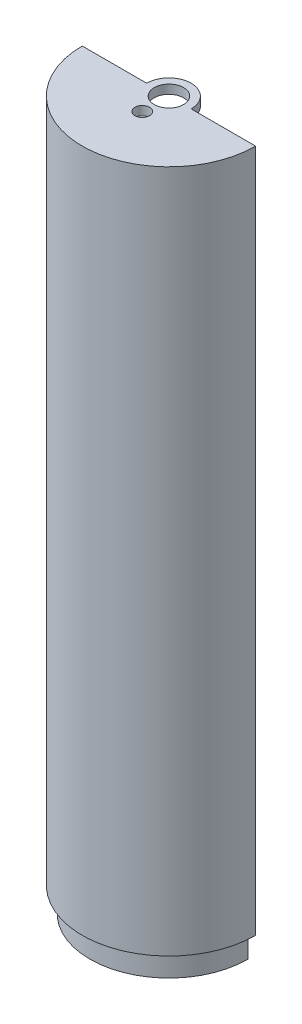
ISO-10303-21;
HEADER;
FILE_DESCRIPTION(('STEP AP214'),'2;1');
FILE_NAME('part.step','',(''),(''),'','','');
FILE_SCHEMA(('AUTOMOTIVE_DESIGN { 1 0 10303 214 1 1 1 1 }'));
ENDSEC;
DATA;
#1=APPLICATION_CONTEXT('core data for automotive mechanical design processes');
#2=APPLICATION_PROTOCOL_DEFINITION('international standard','automotive_design',2000,#1);
#3=PRODUCT_CONTEXT('',#1,'mechanical');
#4=PRODUCT('Part','Part','',(#3));
#5=PRODUCT_RELATED_PRODUCT_CATEGORY('part','',(#4));
#6=PRODUCT_DEFINITION_FORMATION('','',#4);
#7=PRODUCT_DEFINITION_CONTEXT('part definition',#1,'design');
#8=PRODUCT_DEFINITION('design','',#6,#7);
#9=PRODUCT_DEFINITION_SHAPE('','',#8);
#10=(LENGTH_UNIT() NAMED_UNIT(*) SI_UNIT(.MILLI.,.METRE.));
#11=(NAMED_UNIT(*) PLANE_ANGLE_UNIT() SI_UNIT($,.RADIAN.));
#12=(NAMED_UNIT(*) SI_UNIT($,.STERADIAN.) SOLID_ANGLE_UNIT());
#13=UNCERTAINTY_MEASURE_WITH_UNIT(LENGTH_MEASURE(1.E-05),#10,'distance_accuracy_value','');
#14=(GEOMETRIC_REPRESENTATION_CONTEXT(3) GLOBAL_UNCERTAINTY_ASSIGNED_CONTEXT((#13)) GLOBAL_UNIT_ASSIGNED_CONTEXT((#10,
#11,#12)) REPRESENTATION_CONTEXT('',''));
#15=CARTESIAN_POINT('',(0.,0.,0.));
#16=DIRECTION('',(0.,0.,1.));
#17=DIRECTION('',(1.,0.,0.));
#18=AXIS2_PLACEMENT_3D('',#15,#16,#17);
#19=CARTESIAN_POINT('',(0.,384.81,0.));
#20=DIRECTION('',(0.,-1.,0.));
#21=DIRECTION('',(0.,0.,-1.));
#22=AXIS2_PLACEMENT_3D('',#19,#20,#21);
#23=CYLINDRICAL_SURFACE('',#22,12.7);
#24=DIRECTION('',(0.,-1.,0.));
#25=VECTOR('',#24,1.);
#26=CARTESIAN_POINT('',(-12.7,384.81,0.));
#27=LINE('',#26,#25);
#28=CARTESIAN_POINT('',(-12.7,-5.71500000000003,0.));
#29=VERTEX_POINT('',#28);
#30=CARTESIAN_POINT('',(-12.7,-13.97,0.));
#31=VERTEX_POINT('',#30);
#32=EDGE_CURVE('E216',#29,#31,#27,.T.);
#33=ORIENTED_EDGE('',*,*,#32,.F.);
#34=CARTESIAN_POINT('',(0.,-5.71500000000003,0.));
#35=DIRECTION('',(0.,1.,0.));
#36=DIRECTION('',(0.,0.,1.));
#37=AXIS2_PLACEMENT_3D('',#34,#35,#36);
#38=CIRCLE('',#37,12.7);
#39=CARTESIAN_POINT('',(12.7,-5.71500000000003,0.));
#40=VERTEX_POINT('',#39);
#41=EDGE_CURVE('E11',#29,#40,#38,.F.);
#42=ORIENTED_EDGE('',*,*,#41,.T.);
#43=DIRECTION('',(0.,-1.,0.));
#44=VECTOR('',#43,1.);
#45=CARTESIAN_POINT('',(12.7,384.81,0.));
#46=LINE('',#45,#44);
#47=CARTESIAN_POINT('',(12.7,-13.97,0.));
#48=VERTEX_POINT('',#47);
#49=EDGE_CURVE('E219',#40,#48,#46,.T.);
#50=ORIENTED_EDGE('',*,*,#49,.T.);
#51=CARTESIAN_POINT('',(0.,-13.97,0.));
#52=DIRECTION('',(0.,-1.,0.));
#53=DIRECTION('',(0.,0.,-1.));
#54=AXIS2_PLACEMENT_3D('',#51,#52,#53);
#55=CIRCLE('',#54,12.7);
#56=EDGE_CURVE('E199',#31,#48,#55,.T.);
#57=ORIENTED_EDGE('',*,*,#56,.F.);
#58=EDGE_LOOP('',(#33,#42,#50,#57));
#59=FACE_BOUND('',#58,.T.);
#60=ADVANCED_FACE('F37',(#59),#23,.T.);
#61=CARTESIAN_POINT('',(0.,-6.35,0.));
#62=DIRECTION('',(0.,1.,0.));
#63=DIRECTION('',(0.,0.,1.));
#64=AXIS2_PLACEMENT_3D('',#61,#62,#63);
#65=CYLINDRICAL_SURFACE('',#64,49.4538);
#66=DIRECTION('',(0.,-1.,0.));
#67=VECTOR('',#66,1.);
#68=CARTESIAN_POINT('',(-49.4538,384.81,0.));
#69=LINE('',#68,#67);
#70=CARTESIAN_POINT('',(-49.4538,389.89,0.));
#71=VERTEX_POINT('',#70);
#72=CARTESIAN_POINT('',(-49.4538,0.,0.));
#73=VERTEX_POINT('',#72);
#74=EDGE_CURVE('E136',#71,#73,#69,.T.);
#75=ORIENTED_EDGE('',*,*,#74,.T.);
#76=CARTESIAN_POINT('',(0.,0.,0.));
#77=DIRECTION('',(0.,-1.,0.));
#78=DIRECTION('',(0.,0.,-1.));
#79=AXIS2_PLACEMENT_3D('',#76,#77,#78);
#80=CIRCLE('',#79,49.4538);
#81=CARTESIAN_POINT('',(49.4538,0.,0.));
#82=VERTEX_POINT('',#81);
#83=EDGE_CURVE('E61',#82,#73,#80,.T.);
#84=ORIENTED_EDGE('',*,*,#83,.F.);
#85=DIRECTION('',(0.,-1.,0.));
#86=VECTOR('',#85,1.);
#87=CARTESIAN_POINT('',(49.4538,384.81,0.));
#88=LINE('',#87,#86);
#89=CARTESIAN_POINT('',(49.4538,389.89,0.));
#90=VERTEX_POINT('',#89);
#91=EDGE_CURVE('E221',#90,#82,#88,.T.);
#92=ORIENTED_EDGE('',*,*,#91,.F.);
#93=CARTESIAN_POINT('',(0.,389.89,0.));
#94=DIRECTION('',(0.,1.,0.));
#95=DIRECTION('',(0.,0.,1.));
#96=AXIS2_PLACEMENT_3D('',#93,#94,#95);
#97=CIRCLE('',#96,49.4538);
#98=EDGE_CURVE('E140',#71,#90,#97,.T.);
#99=ORIENTED_EDGE('',*,*,#98,.F.);
#100=EDGE_LOOP('',(#75,#84,#92,#99));
#101=FACE_BOUND('',#100,.T.);
#102=ADVANCED_FACE('F39',(#101),#65,.T.);
#103=CARTESIAN_POINT('',(-12.7,384.81,0.));
#104=DIRECTION('',(0.,0.,1.));
#105=DIRECTION('',(1.,0.,0.));
#106=AXIS2_PLACEMENT_3D('',#103,#104,#105);
#107=PLANE('',#106);
#108=DIRECTION('',(0.,1.,0.));
#109=VECTOR('',#108,1.);
#110=CARTESIAN_POINT('',(-46.2788,-6.35,0.));
#111=LINE('',#110,#109);
#112=CARTESIAN_POINT('',(-46.2788,5.715,0.));
#113=VERTEX_POINT('',#112);
#114=CARTESIAN_POINT('',(-46.2788,384.81,0.));
#115=VERTEX_POINT('',#114);
#116=EDGE_CURVE('E227',#113,#115,#111,.T.);
#117=ORIENTED_EDGE('',*,*,#116,.F.);
#118=DIRECTION('',(-1.,0.,0.));
#119=VECTOR('',#118,1.);
#120=CARTESIAN_POINT('',(-46.2788,5.715,0.));
#121=LINE('',#120,#119);
#122=CARTESIAN_POINT('',(-35.56,5.715,0.));
#123=VERTEX_POINT('',#122);
#124=EDGE_CURVE('E170',#123,#113,#121,.T.);
#125=ORIENTED_EDGE('',*,*,#124,.F.);
#126=DIRECTION('',(0.,1.,0.));
#127=VECTOR('',#126,1.);
#128=CARTESIAN_POINT('',(-35.56,-5.715,0.));
#129=LINE('',#128,#127);
#130=CARTESIAN_POINT('',(-35.56,-5.715,0.));
#131=VERTEX_POINT('',#130);
#132=EDGE_CURVE('E189',#123,#131,#129,.F.);
#133=ORIENTED_EDGE('',*,*,#132,.T.);
#134=DIRECTION('',(-1.,0.,0.));
#135=VECTOR('',#134,1.);
#136=CARTESIAN_POINT('',(-12.7,-5.71500000000003,0.));
#137=LINE('',#136,#135);
#138=EDGE_CURVE('E194',#29,#131,#137,.T.);
#139=ORIENTED_EDGE('',*,*,#138,.F.);
#140=ORIENTED_EDGE('',*,*,#32,.T.);
#141=DIRECTION('',(-1.,0.,0.));
#142=VECTOR('',#141,1.);
#143=CARTESIAN_POINT('',(-12.7,-13.97,0.));
#144=LINE('',#143,#142);
#145=CARTESIAN_POINT('',(-45.085,-13.97,0.));
#146=VERTEX_POINT('',#145);
#147=EDGE_CURVE('E202',#31,#146,#144,.T.);
#148=ORIENTED_EDGE('',*,*,#147,.T.);
#149=DIRECTION('',(0.,-1.,0.));
#150=VECTOR('',#149,1.);
#151=CARTESIAN_POINT('',(-45.085,0.,0.));
#152=LINE('',#151,#150);
#153=CARTESIAN_POINT('',(-45.085,0.,0.));
#154=VERTEX_POINT('',#153);
#155=EDGE_CURVE('E212',#154,#146,#152,.T.);
#156=ORIENTED_EDGE('',*,*,#155,.F.);
#157=DIRECTION('',(1.,0.,0.));
#158=VECTOR('',#157,1.);
#159=CARTESIAN_POINT('',(-12.7,0.,0.));
#160=LINE('',#159,#158);
#161=EDGE_CURVE('E214',#73,#154,#160,.T.);
#162=ORIENTED_EDGE('',*,*,#161,.F.);
#163=ORIENTED_EDGE('',*,*,#74,.F.);
#164=DIRECTION('',(-1.,0.,0.));
#165=VECTOR('',#164,1.);
#166=CARTESIAN_POINT('',(-12.7,389.89,0.));
#167=LINE('',#166,#165);
#168=CARTESIAN_POINT('',(-12.7,389.89,0.));
#169=VERTEX_POINT('',#168);
#170=EDGE_CURVE('E127',#169,#71,#167,.T.);
#171=ORIENTED_EDGE('',*,*,#170,.F.);
#172=DIRECTION('',(0.,-1.,0.));
#173=VECTOR('',#172,1.);
#174=CARTESIAN_POINT('',(-12.7,389.89,0.));
#175=LINE('',#174,#173);
#176=CARTESIAN_POINT('',(-12.7,384.81,0.));
#177=VERTEX_POINT('',#176);
#178=EDGE_CURVE('E133',#169,#177,#175,.T.);
#179=ORIENTED_EDGE('',*,*,#178,.T.);
#180=DIRECTION('',(-1.,0.,0.));
#181=VECTOR('',#180,1.);
#182=CARTESIAN_POINT('',(-46.2788,384.81,0.));
#183=LINE('',#182,#181);
#184=EDGE_CURVE('E246',#177,#115,#183,.T.);
#185=ORIENTED_EDGE('',*,*,#184,.T.);
#186=EDGE_LOOP('',(#117,#125,#133,#139,#140,#148,#156,#162,#163,#171,#179,#185));
#187=FACE_BOUND('',#186,.T.);
#188=ADVANCED_FACE('F130',(#187),#107,.F.);
#189=CARTESIAN_POINT('',(49.4538,384.81,0.));
#190=DIRECTION('',(0.,0.,1.));
#191=DIRECTION('',(1.,0.,0.));
#192=AXIS2_PLACEMENT_3D('',#189,#190,#191);
#193=PLANE('',#192);
#194=DIRECTION('',(-1.,0.,0.));
#195=VECTOR('',#194,1.);
#196=CARTESIAN_POINT('',(49.4538,-5.71500000000003,0.));
#197=LINE('',#196,#195);
#198=CARTESIAN_POINT('',(35.56,-5.715,0.));
#199=VERTEX_POINT('',#198);
#200=EDGE_CURVE('E192',#199,#40,#197,.T.);
#201=ORIENTED_EDGE('',*,*,#200,.F.);
#202=DIRECTION('',(0.,1.,0.));
#203=VECTOR('',#202,1.);
#204=CARTESIAN_POINT('',(35.56,-5.715,0.));
#205=LINE('',#204,#203);
#206=CARTESIAN_POINT('',(35.56,5.715,0.));
#207=VERTEX_POINT('',#206);
#208=EDGE_CURVE('E187',#199,#207,#205,.T.);
#209=ORIENTED_EDGE('',*,*,#208,.T.);
#210=DIRECTION('',(-1.,0.,0.));
#211=VECTOR('',#210,1.);
#212=CARTESIAN_POINT('',(35.56,5.715,0.));
#213=LINE('',#212,#211);
#214=CARTESIAN_POINT('',(46.2788,5.715,0.));
#215=VERTEX_POINT('',#214);
#216=EDGE_CURVE('E164',#215,#207,#213,.T.);
#217=ORIENTED_EDGE('',*,*,#216,.F.);
#218=DIRECTION('',(0.,1.,0.));
#219=VECTOR('',#218,1.);
#220=CARTESIAN_POINT('',(46.2788,-6.35,0.));
#221=LINE('',#220,#219);
#222=CARTESIAN_POINT('',(46.2788,384.81,0.));
#223=VERTEX_POINT('',#222);
#224=EDGE_CURVE('E218',#223,#215,#221,.F.);
#225=ORIENTED_EDGE('',*,*,#224,.F.);
#226=DIRECTION('',(-1.,0.,0.));
#227=VECTOR('',#226,1.);
#228=CARTESIAN_POINT('',(35.56,384.81,0.));
#229=LINE('',#228,#227);
#230=CARTESIAN_POINT('',(12.7,384.81,0.));
#231=VERTEX_POINT('',#230);
#232=EDGE_CURVE('E53',#223,#231,#229,.T.);
#233=ORIENTED_EDGE('',*,*,#232,.T.);
#234=DIRECTION('',(0.,-1.,0.));
#235=VECTOR('',#234,1.);
#236=CARTESIAN_POINT('',(12.7,389.89,0.));
#237=LINE('',#236,#235);
#238=CARTESIAN_POINT('',(12.7,389.89,0.));
#239=VERTEX_POINT('',#238);
#240=EDGE_CURVE('E154',#239,#231,#237,.T.);
#241=ORIENTED_EDGE('',*,*,#240,.F.);
#242=DIRECTION('',(-1.,0.,0.));
#243=VECTOR('',#242,1.);
#244=CARTESIAN_POINT('',(49.4538,389.89,0.));
#245=LINE('',#244,#243);
#246=EDGE_CURVE('E146',#90,#239,#245,.T.);
#247=ORIENTED_EDGE('',*,*,#246,.F.);
#248=ORIENTED_EDGE('',*,*,#91,.T.);
#249=DIRECTION('',(1.,0.,0.));
#250=VECTOR('',#249,1.);
#251=CARTESIAN_POINT('',(49.4538,0.,0.));
#252=LINE('',#251,#250);
#253=CARTESIAN_POINT('',(45.085,0.,0.));
#254=VERTEX_POINT('',#253);
#255=EDGE_CURVE('E46',#254,#82,#252,.T.);
#256=ORIENTED_EDGE('',*,*,#255,.F.);
#257=DIRECTION('',(0.,-1.,0.));
#258=VECTOR('',#257,1.);
#259=CARTESIAN_POINT('',(45.085,0.,0.));
#260=LINE('',#259,#258);
#261=CARTESIAN_POINT('',(45.085,-13.97,0.));
#262=VERTEX_POINT('',#261);
#263=EDGE_CURVE('E233',#262,#254,#260,.F.);
#264=ORIENTED_EDGE('',*,*,#263,.F.);
#265=DIRECTION('',(-1.,0.,0.));
#266=VECTOR('',#265,1.);
#267=CARTESIAN_POINT('',(45.085,-13.97,0.));
#268=LINE('',#267,#266);
#269=EDGE_CURVE('E196',#262,#48,#268,.T.);
#270=ORIENTED_EDGE('',*,*,#269,.T.);
#271=ORIENTED_EDGE('',*,*,#49,.F.);
#272=EDGE_LOOP('',(#201,#209,#217,#225,#233,#241,#247,#248,#256,#264,#270,#271));
#273=FACE_BOUND('',#272,.T.);
#274=ADVANCED_FACE('F241',(#273),#193,.F.);
#275=CARTESIAN_POINT('',(0.,-6.35,0.));
#276=DIRECTION('',(0.,1.,0.));
#277=DIRECTION('',(0.,0.,1.));
#278=AXIS2_PLACEMENT_3D('',#275,#276,#277);
#279=CYLINDRICAL_SURFACE('',#278,46.2788);
#280=ORIENTED_EDGE('',*,*,#224,.T.);
#281=CARTESIAN_POINT('',(0.,5.715,0.));
#282=DIRECTION('',(0.,1.,0.));
#283=DIRECTION('',(0.,0.,1.));
#284=AXIS2_PLACEMENT_3D('',#281,#282,#283);
#285=CIRCLE('',#284,46.2788);
#286=EDGE_CURVE('E161',#113,#215,#285,.T.);
#287=ORIENTED_EDGE('',*,*,#286,.F.);
#288=ORIENTED_EDGE('',*,*,#116,.T.);
#289=CARTESIAN_POINT('',(0.,384.81,0.));
#290=DIRECTION('',(0.,1.,0.));
#291=DIRECTION('',(0.,0.,1.));
#292=AXIS2_PLACEMENT_3D('',#289,#290,#291);
#293=CIRCLE('',#292,46.2788);
#294=EDGE_CURVE('E230',#115,#223,#293,.T.);
#295=ORIENTED_EDGE('',*,*,#294,.T.);
#296=EDGE_LOOP('',(#280,#287,#288,#295));
#297=FACE_BOUND('',#296,.T.);
#298=ADVANCED_FACE('F252',(#297),#279,.F.);
#299=CARTESIAN_POINT('',(0.,0.,0.));
#300=DIRECTION('',(0.,-1.,0.));
#301=DIRECTION('',(0.,0.,-1.));
#302=AXIS2_PLACEMENT_3D('',#299,#300,#301);
#303=PLANE('',#302);
#304=ORIENTED_EDGE('',*,*,#161,.T.);
#305=CARTESIAN_POINT('',(0.,0.,0.));
#306=DIRECTION('',(0.,-1.,0.));
#307=DIRECTION('',(0.,0.,-1.));
#308=AXIS2_PLACEMENT_3D('',#305,#306,#307);
#309=CIRCLE('',#308,45.085);
#310=EDGE_CURVE('E208',#254,#154,#309,.T.);
#311=ORIENTED_EDGE('',*,*,#310,.F.);
#312=ORIENTED_EDGE('',*,*,#255,.T.);
#313=ORIENTED_EDGE('',*,*,#83,.T.);
#314=EDGE_LOOP('',(#304,#311,#312,#313));
#315=FACE_BOUND('',#314,.T.);
#316=ADVANCED_FACE('F237',(#315),#303,.T.);
#317=CARTESIAN_POINT('',(0.,0.,0.));
#318=DIRECTION('',(0.,-1.,0.));
#319=DIRECTION('',(0.,0.,-1.));
#320=AXIS2_PLACEMENT_3D('',#317,#318,#319);
#321=CYLINDRICAL_SURFACE('',#320,45.085);
#322=ORIENTED_EDGE('',*,*,#155,.T.);
#323=CARTESIAN_POINT('',(0.,-13.97,0.));
#324=DIRECTION('',(0.,-1.,0.));
#325=DIRECTION('',(0.,0.,-1.));
#326=AXIS2_PLACEMENT_3D('',#323,#324,#325);
#327=CIRCLE('',#326,45.085);
#328=EDGE_CURVE('E205',#262,#146,#327,.T.);
#329=ORIENTED_EDGE('',*,*,#328,.F.);
#330=ORIENTED_EDGE('',*,*,#263,.T.);
#331=ORIENTED_EDGE('',*,*,#310,.T.);
#332=EDGE_LOOP('',(#322,#329,#330,#331));
#333=FACE_BOUND('',#332,.T.);
#334=ADVANCED_FACE('F273',(#333),#321,.T.);
#335=CARTESIAN_POINT('',(0.,-13.97,0.));
#336=DIRECTION('',(0.,-1.,0.));
#337=DIRECTION('',(0.,0.,-1.));
#338=AXIS2_PLACEMENT_3D('',#335,#336,#337);
#339=PLANE('',#338);
#340=CARTESIAN_POINT('',(0.,-13.97,15.24));
#341=DIRECTION('',(0.,-1.,0.));
#342=DIRECTION('',(0.,0.,-1.));
#343=AXIS2_PLACEMENT_3D('',#340,#341,#342);
#344=CIRCLE('',#343,4.191);
#345=CARTESIAN_POINT('',(0.,-13.97,11.049));
#346=VERTEX_POINT('',#345);
#347=EDGE_CURVE('E153',#346,#346,#344,.T.);
#348=ORIENTED_EDGE('',*,*,#347,.F.);
#349=EDGE_LOOP('',(#348));
#350=FACE_BOUND('',#349,.T.);
#351=CARTESIAN_POINT('',(0.,-13.97,0.));
#352=DIRECTION('',(0.,1.,0.));
#353=DIRECTION('',(0.,0.,1.));
#354=AXIS2_PLACEMENT_3D('',#351,#352,#353);
#355=CIRCLE('',#354,3.302);
#356=CARTESIAN_POINT('',(0.,-13.97,3.302));
#357=VERTEX_POINT('',#356);
#358=EDGE_CURVE('E173',#357,#357,#355,.T.);
#359=ORIENTED_EDGE('',*,*,#358,.T.);
#360=EDGE_LOOP('',(#359));
#361=FACE_BOUND('',#360,.T.);
#362=ORIENTED_EDGE('',*,*,#269,.F.);
#363=ORIENTED_EDGE('',*,*,#328,.T.);
#364=ORIENTED_EDGE('',*,*,#147,.F.);
#365=ORIENTED_EDGE('',*,*,#56,.T.);
#366=EDGE_LOOP('',(#362,#363,#364,#365));
#367=FACE_BOUND('',#366,.T.);
#368=ADVANCED_FACE('F269',(#350,#361,#367),#339,.T.);
#369=CARTESIAN_POINT('',(0.,-5.715,0.));
#370=DIRECTION('',(0.,1.,0.));
#371=DIRECTION('',(0.,0.,1.));
#372=AXIS2_PLACEMENT_3D('',#369,#370,#371);
#373=PLANE('',#372);
#374=CARTESIAN_POINT('',(0.,-5.71500000000003,15.24));
#375=DIRECTION('',(0.,1.,0.));
#376=DIRECTION('',(0.,0.,1.));
#377=AXIS2_PLACEMENT_3D('',#374,#375,#376);
#378=CIRCLE('',#377,4.191);
#379=CARTESIAN_POINT('',(0.,-5.71500000000003,19.431));
#380=VERTEX_POINT('',#379);
#381=EDGE_CURVE('E41',#380,#380,#378,.T.);
#382=ORIENTED_EDGE('',*,*,#381,.F.);
#383=EDGE_LOOP('',(#382));
#384=FACE_BOUND('',#383,.T.);
#385=CARTESIAN_POINT('',(0.,-5.715,0.));
#386=DIRECTION('',(0.,1.,0.));
#387=DIRECTION('',(0.,0.,1.));
#388=AXIS2_PLACEMENT_3D('',#385,#386,#387);
#389=CIRCLE('',#388,8.382);
#390=CARTESIAN_POINT('',(0.,-5.715,8.382));
#391=VERTEX_POINT('',#390);
#392=EDGE_CURVE('E176',#391,#391,#389,.T.);
#393=ORIENTED_EDGE('',*,*,#392,.F.);
#394=EDGE_LOOP('',(#393));
#395=FACE_BOUND('',#394,.T.);
#396=ORIENTED_EDGE('',*,*,#138,.T.);
#397=CARTESIAN_POINT('',(0.,-5.715,0.));
#398=DIRECTION('',(0.,1.,0.));
#399=DIRECTION('',(0.,0.,1.));
#400=AXIS2_PLACEMENT_3D('',#397,#398,#399);
#401=CIRCLE('',#400,35.56);
#402=EDGE_CURVE('E182',#131,#199,#401,.T.);
#403=ORIENTED_EDGE('',*,*,#402,.T.);
#404=ORIENTED_EDGE('',*,*,#200,.T.);
#405=ORIENTED_EDGE('',*,*,#41,.F.);
#406=EDGE_LOOP('',(#396,#403,#404,#405));
#407=FACE_BOUND('',#406,.T.);
#408=ADVANCED_FACE('F262',(#384,#395,#407),#373,.T.);
#409=CARTESIAN_POINT('',(0.,-5.715,0.));
#410=DIRECTION('',(0.,1.,0.));
#411=DIRECTION('',(0.,0.,1.));
#412=AXIS2_PLACEMENT_3D('',#409,#410,#411);
#413=CYLINDRICAL_SURFACE('',#412,35.56);
#414=ORIENTED_EDGE('',*,*,#132,.F.);
#415=CARTESIAN_POINT('',(0.,5.715,0.));
#416=DIRECTION('',(0.,-1.,0.));
#417=DIRECTION('',(0.,0.,1.));
#418=AXIS2_PLACEMENT_3D('',#415,#416,#417);
#419=CIRCLE('',#418,35.56);
#420=EDGE_CURVE('E167',#207,#123,#419,.T.);
#421=ORIENTED_EDGE('',*,*,#420,.F.);
#422=ORIENTED_EDGE('',*,*,#208,.F.);
#423=ORIENTED_EDGE('',*,*,#402,.F.);
#424=EDGE_LOOP('',(#414,#421,#422,#423));
#425=FACE_BOUND('',#424,.T.);
#426=ADVANCED_FACE('F260',(#425),#413,.F.);
#427=CARTESIAN_POINT('',(0.,-10.795,0.));
#428=DIRECTION('',(0.,1.,0.));
#429=DIRECTION('',(0.,0.,1.));
#430=AXIS2_PLACEMENT_3D('',#427,#428,#429);
#431=CYLINDRICAL_SURFACE('',#430,8.382);
#432=CARTESIAN_POINT('',(0.,-10.795,0.));
#433=DIRECTION('',(0.,1.,0.));
#434=DIRECTION('',(0.,0.,1.));
#435=AXIS2_PLACEMENT_3D('',#432,#433,#434);
#436=CIRCLE('',#435,8.382);
#437=CARTESIAN_POINT('',(0.,-10.795,8.382));
#438=VERTEX_POINT('',#437);
#439=EDGE_CURVE('E179',#438,#438,#436,.T.);
#440=ORIENTED_EDGE('',*,*,#439,.F.);
#441=EDGE_LOOP('',(#440));
#442=FACE_BOUND('',#441,.T.);
#443=ORIENTED_EDGE('',*,*,#392,.T.);
#444=EDGE_LOOP('',(#443));
#445=FACE_BOUND('',#444,.T.);
#446=ADVANCED_FACE('F321',(#442,#445),#431,.F.);
#447=CARTESIAN_POINT('',(0.,-10.795,0.));
#448=DIRECTION('',(0.,1.,0.));
#449=DIRECTION('',(0.,0.,1.));
#450=AXIS2_PLACEMENT_3D('',#447,#448,#449);
#451=PLANE('',#450);
#452=CARTESIAN_POINT('',(0.,-10.795,0.));
#453=DIRECTION('',(0.,1.,0.));
#454=DIRECTION('',(0.,0.,1.));
#455=AXIS2_PLACEMENT_3D('',#452,#453,#454);
#456=CIRCLE('',#455,3.302);
#457=CARTESIAN_POINT('',(0.,-10.795,3.302));
#458=VERTEX_POINT('',#457);
#459=EDGE_CURVE('E172',#458,#458,#456,.T.);
#460=ORIENTED_EDGE('',*,*,#459,.F.);
#461=EDGE_LOOP('',(#460));
#462=FACE_BOUND('',#461,.T.);
#463=ORIENTED_EDGE('',*,*,#439,.T.);
#464=EDGE_LOOP('',(#463));
#465=FACE_BOUND('',#464,.T.);
#466=ADVANCED_FACE('F326',(#462,#465),#451,.T.);
#467=CARTESIAN_POINT('',(0.,-13.97,0.));
#468=DIRECTION('',(0.,1.,0.));
#469=DIRECTION('',(0.,0.,1.));
#470=AXIS2_PLACEMENT_3D('',#467,#468,#469);
#471=CYLINDRICAL_SURFACE('',#470,3.302);
#472=ORIENTED_EDGE('',*,*,#358,.F.);
#473=EDGE_LOOP('',(#472));
#474=FACE_BOUND('',#473,.T.);
#475=ORIENTED_EDGE('',*,*,#459,.T.);
#476=EDGE_LOOP('',(#475));
#477=FACE_BOUND('',#476,.T.);
#478=ADVANCED_FACE('F338',(#474,#477),#471,.F.);
#479=CARTESIAN_POINT('',(0.,5.715,0.));
#480=DIRECTION('',(0.,1.,0.));
#481=DIRECTION('',(0.,0.,1.));
#482=AXIS2_PLACEMENT_3D('',#479,#480,#481);
#483=PLANE('',#482);
#484=ORIENTED_EDGE('',*,*,#286,.T.);
#485=ORIENTED_EDGE('',*,*,#216,.T.);
#486=ORIENTED_EDGE('',*,*,#420,.T.);
#487=ORIENTED_EDGE('',*,*,#124,.T.);
#488=EDGE_LOOP('',(#484,#485,#486,#487));
#489=FACE_BOUND('',#488,.T.);
#490=ADVANCED_FACE('F254',(#489),#483,.T.);
#491=CARTESIAN_POINT('',(0.,384.81,15.24));
#492=DIRECTION('',(0.,-1.,0.));
#493=DIRECTION('',(0.,0.,-1.));
#494=AXIS2_PLACEMENT_3D('',#491,#492,#493);
#495=CYLINDRICAL_SURFACE('',#494,4.191);
#496=ORIENTED_EDGE('',*,*,#381,.T.);
#497=EDGE_LOOP('',(#496));
#498=FACE_BOUND('',#497,.T.);
#499=ORIENTED_EDGE('',*,*,#347,.T.);
#500=EDGE_LOOP('',(#499));
#501=FACE_BOUND('',#500,.T.);
#502=ADVANCED_FACE('F367',(#498,#501),#495,.F.);
#503=CARTESIAN_POINT('',(0.,384.81,0.));
#504=DIRECTION('',(0.,1.,0.));
#505=DIRECTION('',(0.,0.,1.));
#506=AXIS2_PLACEMENT_3D('',#503,#504,#505);
#507=PLANE('',#506);
#508=CARTESIAN_POINT('',(0.,384.81,15.24));
#509=DIRECTION('',(0.,1.,0.));
#510=DIRECTION('',(0.,0.,1.));
#511=AXIS2_PLACEMENT_3D('',#508,#509,#510);
#512=CIRCLE('',#511,4.191);
#513=CARTESIAN_POINT('',(0.,384.81,19.431));
#514=VERTEX_POINT('',#513);
#515=EDGE_CURVE('E466',#514,#514,#512,.F.);
#516=ORIENTED_EDGE('',*,*,#515,.F.);
#517=EDGE_LOOP('',(#516));
#518=FACE_BOUND('',#517,.T.);
#519=CARTESIAN_POINT('',(0.,384.81,0.));
#520=DIRECTION('',(0.,-1.,0.));
#521=DIRECTION('',(0.,0.,-1.));
#522=AXIS2_PLACEMENT_3D('',#519,#520,#521);
#523=CIRCLE('',#522,8.382);
#524=CARTESIAN_POINT('',(0.,384.81,-8.382));
#525=VERTEX_POINT('',#524);
#526=EDGE_CURVE('E467',#525,#525,#523,.T.);
#527=ORIENTED_EDGE('',*,*,#526,.F.);
#528=EDGE_LOOP('',(#527));
#529=FACE_BOUND('',#528,.T.);
#530=ORIENTED_EDGE('',*,*,#294,.F.);
#531=ORIENTED_EDGE('',*,*,#184,.F.);
#532=CARTESIAN_POINT('',(0.,384.81,0.));
#533=DIRECTION('',(0.,1.,0.));
#534=DIRECTION('',(0.,0.,1.));
#535=AXIS2_PLACEMENT_3D('',#532,#533,#534);
#536=CIRCLE('',#535,12.7);
#537=EDGE_CURVE('E152',#231,#177,#536,.T.);
#538=ORIENTED_EDGE('',*,*,#537,.F.);
#539=ORIENTED_EDGE('',*,*,#232,.F.);
#540=EDGE_LOOP('',(#530,#531,#538,#539));
#541=FACE_BOUND('',#540,.T.);
#542=ADVANCED_FACE('F248',(#518,#529,#541),#507,.F.);
#543=CARTESIAN_POINT('',(0.,389.89,0.));
#544=DIRECTION('',(0.,-1.,0.));
#545=DIRECTION('',(0.,0.,-1.));
#546=AXIS2_PLACEMENT_3D('',#543,#544,#545);
#547=CYLINDRICAL_SURFACE('',#546,12.7);
#548=ORIENTED_EDGE('',*,*,#537,.T.);
#549=ORIENTED_EDGE('',*,*,#178,.F.);
#550=CARTESIAN_POINT('',(0.,389.89,0.));
#551=DIRECTION('',(0.,1.,0.));
#552=DIRECTION('',(0.,0.,1.));
#553=AXIS2_PLACEMENT_3D('',#550,#551,#552);
#554=CIRCLE('',#553,12.7);
#555=EDGE_CURVE('E141',#239,#169,#554,.T.);
#556=ORIENTED_EDGE('',*,*,#555,.F.);
#557=ORIENTED_EDGE('',*,*,#240,.T.);
#558=EDGE_LOOP('',(#548,#549,#556,#557));
#559=FACE_BOUND('',#558,.T.);
#560=ADVANCED_FACE('F151',(#559),#547,.T.);
#561=CARTESIAN_POINT('',(0.,389.89,0.));
#562=DIRECTION('',(0.,1.,0.));
#563=DIRECTION('',(0.,0.,1.));
#564=AXIS2_PLACEMENT_3D('',#561,#562,#563);
#565=PLANE('',#564);
#566=CARTESIAN_POINT('',(0.,389.89,15.24));
#567=DIRECTION('',(0.,1.,0.));
#568=DIRECTION('',(0.,0.,1.));
#569=AXIS2_PLACEMENT_3D('',#566,#567,#568);
#570=CIRCLE('',#569,4.191);
#571=CARTESIAN_POINT('',(0.,389.89,19.431));
#572=VERTEX_POINT('',#571);
#573=EDGE_CURVE('E463',#572,#572,#570,.T.);
#574=ORIENTED_EDGE('',*,*,#573,.F.);
#575=EDGE_LOOP('',(#574));
#576=FACE_BOUND('',#575,.T.);
#577=CARTESIAN_POINT('',(0.,389.89,0.));
#578=DIRECTION('',(0.,-1.,0.));
#579=DIRECTION('',(0.,0.,-1.));
#580=AXIS2_PLACEMENT_3D('',#577,#578,#579);
#581=CIRCLE('',#580,8.382);
#582=CARTESIAN_POINT('',(0.,389.89,-8.382));
#583=VERTEX_POINT('',#582);
#584=EDGE_CURVE('E247',#583,#583,#581,.T.);
#585=ORIENTED_EDGE('',*,*,#584,.T.);
#586=EDGE_LOOP('',(#585));
#587=FACE_BOUND('',#586,.T.);
#588=ORIENTED_EDGE('',*,*,#555,.T.);
#589=ORIENTED_EDGE('',*,*,#170,.T.);
#590=ORIENTED_EDGE('',*,*,#98,.T.);
#591=ORIENTED_EDGE('',*,*,#246,.T.);
#592=EDGE_LOOP('',(#588,#589,#590,#591));
#593=FACE_BOUND('',#592,.T.);
#594=ADVANCED_FACE('F144',(#576,#587,#593),#565,.T.);
#595=CARTESIAN_POINT('',(0.,389.89,0.));
#596=DIRECTION('',(0.,-1.,0.));
#597=DIRECTION('',(0.,0.,-1.));
#598=AXIS2_PLACEMENT_3D('',#595,#596,#597);
#599=CYLINDRICAL_SURFACE('',#598,8.382);
#600=ORIENTED_EDGE('',*,*,#584,.F.);
#601=EDGE_LOOP('',(#600));
#602=FACE_BOUND('',#601,.T.);
#603=ORIENTED_EDGE('',*,*,#526,.T.);
#604=EDGE_LOOP('',(#603));
#605=FACE_BOUND('',#604,.T.);
#606=ADVANCED_FACE('F436',(#602,#605),#599,.F.);
#607=CARTESIAN_POINT('',(0.,-13.971,15.24));
#608=DIRECTION('',(0.,1.,0.));
#609=DIRECTION('',(0.,0.,1.));
#610=AXIS2_PLACEMENT_3D('',#607,#608,#609);
#611=CYLINDRICAL_SURFACE('',#610,4.191);
#612=ORIENTED_EDGE('',*,*,#573,.T.);
#613=EDGE_LOOP('',(#612));
#614=FACE_BOUND('',#613,.T.);
#615=ORIENTED_EDGE('',*,*,#515,.T.);
#616=EDGE_LOOP('',(#615));
#617=FACE_BOUND('',#616,.T.);
#618=ADVANCED_FACE('F445',(#614,#617),#611,.F.);
#619=CLOSED_SHELL('',(#60,#102,#188,#274,#298,#316,#334,#368,#408,#426,#446,#466,#478,#490,#502,
#542,#560,#594,#606,#618));
#620=MANIFOLD_SOLID_BREP('B2',#619);
#621=ADVANCED_BREP_SHAPE_REPRESENTATION('',(#18,#620),#14);
#622=SHAPE_DEFINITION_REPRESENTATION(#9,#621);
ENDSEC;
END-ISO-10303-21;
